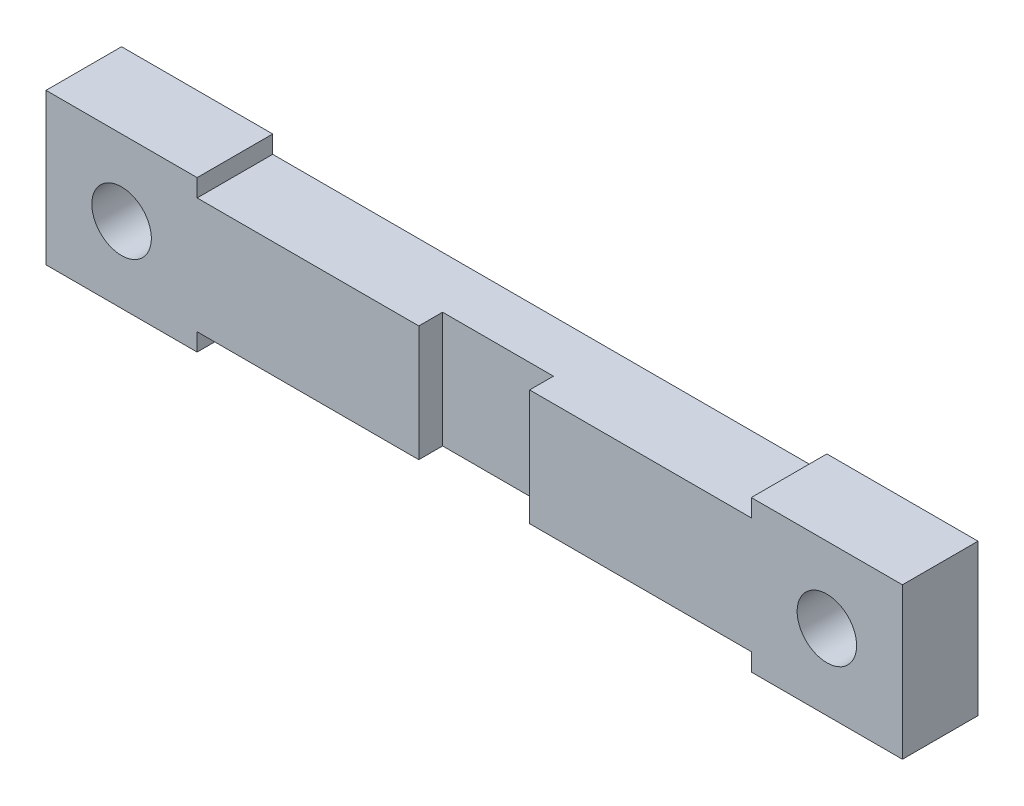
ISO-10303-21;
HEADER;
FILE_DESCRIPTION(('STEP AP214'),'2;1');
FILE_NAME('part.step','',(''),(''),'','','');
FILE_SCHEMA(('AUTOMOTIVE_DESIGN { 1 0 10303 214 1 1 1 1 }'));
ENDSEC;
DATA;
#1=APPLICATION_CONTEXT('core data for automotive mechanical design processes');
#2=APPLICATION_PROTOCOL_DEFINITION('international standard','automotive_design',2000,#1);
#3=PRODUCT_CONTEXT('',#1,'mechanical');
#4=PRODUCT('Part','Part','',(#3));
#5=PRODUCT_RELATED_PRODUCT_CATEGORY('part','',(#4));
#6=PRODUCT_DEFINITION_FORMATION('','',#4);
#7=PRODUCT_DEFINITION_CONTEXT('part definition',#1,'design');
#8=PRODUCT_DEFINITION('design','',#6,#7);
#9=PRODUCT_DEFINITION_SHAPE('','',#8);
#10=(LENGTH_UNIT() NAMED_UNIT(*) SI_UNIT(.MILLI.,.METRE.));
#11=(NAMED_UNIT(*) PLANE_ANGLE_UNIT() SI_UNIT($,.RADIAN.));
#12=(NAMED_UNIT(*) SI_UNIT($,.STERADIAN.) SOLID_ANGLE_UNIT());
#13=UNCERTAINTY_MEASURE_WITH_UNIT(LENGTH_MEASURE(1.E-05),#10,'distance_accuracy_value','');
#14=(GEOMETRIC_REPRESENTATION_CONTEXT(3) GLOBAL_UNCERTAINTY_ASSIGNED_CONTEXT((#13)) GLOBAL_UNIT_ASSIGNED_CONTEXT((#10,
#11,#12)) REPRESENTATION_CONTEXT('',''));
#15=CARTESIAN_POINT('',(0.,0.,0.));
#16=DIRECTION('',(0.,0.,1.));
#17=DIRECTION('',(1.,0.,0.));
#18=AXIS2_PLACEMENT_3D('',#15,#16,#17);
#19=CARTESIAN_POINT('',(0.,0.,3.81));
#20=DIRECTION('',(0.,0.,1.));
#21=DIRECTION('',(1.,0.,0.));
#22=AXIS2_PLACEMENT_3D('',#19,#20,#21);
#23=PLANE('',#22);
#24=DIRECTION('',(0.,1.,0.));
#25=VECTOR('',#24,1.);
#26=CARTESIAN_POINT('',(2.794,-2.921,3.81));
#27=LINE('',#26,#25);
#28=CARTESIAN_POINT('',(2.794,-2.921,3.81));
#29=VERTEX_POINT('',#28);
#30=CARTESIAN_POINT('',(2.794,2.921,3.81));
#31=VERTEX_POINT('',#30);
#32=EDGE_CURVE('E285',#29,#31,#27,.T.);
#33=ORIENTED_EDGE('',*,*,#32,.F.);
#34=DIRECTION('',(1.,0.,0.));
#35=VECTOR('',#34,1.);
#36=CARTESIAN_POINT('',(0.,-2.921,3.81));
#37=LINE('',#36,#35);
#38=CARTESIAN_POINT('',(13.97,-2.921,3.81));
#39=VERTEX_POINT('',#38);
#40=EDGE_CURVE('E260',#29,#39,#37,.T.);
#41=ORIENTED_EDGE('',*,*,#40,.T.);
#42=DIRECTION('',(0.,-1.,0.));
#43=VECTOR('',#42,1.);
#44=CARTESIAN_POINT('',(13.97,0.,3.81));
#45=LINE('',#44,#43);
#46=CARTESIAN_POINT('',(13.97,-3.81,3.81));
#47=VERTEX_POINT('',#46);
#48=EDGE_CURVE('E164',#39,#47,#45,.T.);
#49=ORIENTED_EDGE('',*,*,#48,.T.);
#50=DIRECTION('',(1.,0.,0.));
#51=VECTOR('',#50,1.);
#52=CARTESIAN_POINT('',(0.,-3.81,3.81));
#53=LINE('',#52,#51);
#54=CARTESIAN_POINT('',(21.59,-3.81,3.81));
#55=VERTEX_POINT('',#54);
#56=EDGE_CURVE('E171',#47,#55,#53,.T.);
#57=ORIENTED_EDGE('',*,*,#56,.T.);
#58=DIRECTION('',(0.,-1.,0.));
#59=VECTOR('',#58,1.);
#60=CARTESIAN_POINT('',(21.59,0.,3.81));
#61=LINE('',#60,#59);
#62=CARTESIAN_POINT('',(21.59,3.81,3.81));
#63=VERTEX_POINT('',#62);
#64=EDGE_CURVE('E169',#63,#55,#61,.T.);
#65=ORIENTED_EDGE('',*,*,#64,.F.);
#66=DIRECTION('',(1.,0.,0.));
#67=VECTOR('',#66,1.);
#68=CARTESIAN_POINT('',(0.,3.81,3.81));
#69=LINE('',#68,#67);
#70=CARTESIAN_POINT('',(13.97,3.81,3.81));
#71=VERTEX_POINT('',#70);
#72=EDGE_CURVE('E147',#71,#63,#69,.T.);
#73=ORIENTED_EDGE('',*,*,#72,.F.);
#74=CARTESIAN_POINT('',(13.97,2.921,3.81));
#75=VERTEX_POINT('',#74);
#76=EDGE_CURVE('E158',#71,#75,#45,.T.);
#77=ORIENTED_EDGE('',*,*,#76,.T.);
#78=DIRECTION('',(1.,0.,0.));
#79=VECTOR('',#78,1.);
#80=CARTESIAN_POINT('',(0.,2.921,3.81));
#81=LINE('',#80,#79);
#82=EDGE_CURVE('E162',#31,#75,#81,.T.);
#83=ORIENTED_EDGE('',*,*,#82,.F.);
#84=EDGE_LOOP('',(#33,#41,#49,#57,#65,#73,#77,#83));
#85=FACE_BOUND('',#84,.T.);
#86=CARTESIAN_POINT('',(17.78,0.,3.81));
#87=DIRECTION('',(0.,0.,1.));
#88=DIRECTION('',(1.,0.,0.));
#89=AXIS2_PLACEMENT_3D('',#86,#87,#88);
#90=CIRCLE('',#89,1.5);
#91=CARTESIAN_POINT('',(16.28,0.,3.81));
#92=VERTEX_POINT('',#91);
#93=EDGE_CURVE('E180',#92,#92,#90,.T.);
#94=ORIENTED_EDGE('',*,*,#93,.F.);
#95=EDGE_LOOP('',(#94));
#96=FACE_BOUND('',#95,.T.);
#97=ADVANCED_FACE('F41',(#85,#96),#23,.T.);
#98=CARTESIAN_POINT('',(-13.97,0.,3.81));
#99=DIRECTION('',(1.,0.,0.));
#100=DIRECTION('',(0.,0.,-1.));
#101=AXIS2_PLACEMENT_3D('',#98,#99,#100);
#102=PLANE('',#101);
#103=DIRECTION('',(0.,-1.,0.));
#104=VECTOR('',#103,1.);
#105=CARTESIAN_POINT('',(-13.97,0.,0.));
#106=LINE('',#105,#104);
#107=CARTESIAN_POINT('',(-13.97,3.81,0.));
#108=VERTEX_POINT('',#107);
#109=CARTESIAN_POINT('',(-13.97,2.921,0.));
#110=VERTEX_POINT('',#109);
#111=EDGE_CURVE('E183',#108,#110,#106,.T.);
#112=ORIENTED_EDGE('',*,*,#111,.F.);
#113=DIRECTION('',(0.,0.,-1.));
#114=VECTOR('',#113,1.);
#115=CARTESIAN_POINT('',(-13.97,3.81,3.81));
#116=LINE('',#115,#114);
#117=CARTESIAN_POINT('',(-13.97,3.81,3.81));
#118=VERTEX_POINT('',#117);
#119=EDGE_CURVE('E11',#118,#108,#116,.T.);
#120=ORIENTED_EDGE('',*,*,#119,.F.);
#121=DIRECTION('',(0.,-1.,0.));
#122=VECTOR('',#121,1.);
#123=CARTESIAN_POINT('',(-13.97,0.,3.81));
#124=LINE('',#123,#122);
#125=CARTESIAN_POINT('',(-13.97,2.921,3.81));
#126=VERTEX_POINT('',#125);
#127=EDGE_CURVE('E216',#118,#126,#124,.T.);
#128=ORIENTED_EDGE('',*,*,#127,.T.);
#129=DIRECTION('',(0.,0.,-1.));
#130=VECTOR('',#129,1.);
#131=CARTESIAN_POINT('',(-13.97,2.921,3.81));
#132=LINE('',#131,#130);
#133=EDGE_CURVE('E65',#126,#110,#132,.T.);
#134=ORIENTED_EDGE('',*,*,#133,.T.);
#135=EDGE_LOOP('',(#112,#120,#128,#134));
#136=FACE_BOUND('',#135,.T.);
#137=ADVANCED_FACE('F322',(#136),#102,.T.);
#138=CARTESIAN_POINT('',(0.,3.81,3.81));
#139=DIRECTION('',(0.,-1.,0.));
#140=DIRECTION('',(0.,0.,-1.));
#141=AXIS2_PLACEMENT_3D('',#138,#139,#140);
#142=PLANE('',#141);
#143=DIRECTION('',(-1.,0.,0.));
#144=VECTOR('',#143,1.);
#145=CARTESIAN_POINT('',(0.,3.81,0.));
#146=LINE('',#145,#144);
#147=CARTESIAN_POINT('',(-21.59,3.81,0.));
#148=VERTEX_POINT('',#147);
#149=EDGE_CURVE('E185',#108,#148,#146,.T.);
#150=ORIENTED_EDGE('',*,*,#149,.T.);
#151=DIRECTION('',(0.,0.,-1.));
#152=VECTOR('',#151,1.);
#153=CARTESIAN_POINT('',(-21.59,3.81,3.81));
#154=LINE('',#153,#152);
#155=CARTESIAN_POINT('',(-21.59,3.81,3.81));
#156=VERTEX_POINT('',#155);
#157=EDGE_CURVE('E49',#156,#148,#154,.T.);
#158=ORIENTED_EDGE('',*,*,#157,.F.);
#159=DIRECTION('',(-1.,0.,0.));
#160=VECTOR('',#159,1.);
#161=CARTESIAN_POINT('',(0.,3.81,3.81));
#162=LINE('',#161,#160);
#163=EDGE_CURVE('E262',#118,#156,#162,.T.);
#164=ORIENTED_EDGE('',*,*,#163,.F.);
#165=ORIENTED_EDGE('',*,*,#119,.T.);
#166=EDGE_LOOP('',(#150,#158,#164,#165));
#167=FACE_BOUND('',#166,.T.);
#168=ADVANCED_FACE('F43',(#167),#142,.F.);
#169=CARTESIAN_POINT('',(-21.59,0.,3.81));
#170=DIRECTION('',(1.,0.,0.));
#171=DIRECTION('',(0.,0.,-1.));
#172=AXIS2_PLACEMENT_3D('',#169,#170,#171);
#173=PLANE('',#172);
#174=DIRECTION('',(0.,-1.,0.));
#175=VECTOR('',#174,1.);
#176=CARTESIAN_POINT('',(-21.59,0.,0.));
#177=LINE('',#176,#175);
#178=CARTESIAN_POINT('',(-21.59,-3.81,0.));
#179=VERTEX_POINT('',#178);
#180=EDGE_CURVE('E189',#148,#179,#177,.T.);
#181=ORIENTED_EDGE('',*,*,#180,.T.);
#182=DIRECTION('',(0.,0.,-1.));
#183=VECTOR('',#182,1.);
#184=CARTESIAN_POINT('',(-21.59,-3.81,3.81));
#185=LINE('',#184,#183);
#186=CARTESIAN_POINT('',(-21.59,-3.81,3.81));
#187=VERTEX_POINT('',#186);
#188=EDGE_CURVE('E232',#187,#179,#185,.T.);
#189=ORIENTED_EDGE('',*,*,#188,.F.);
#190=DIRECTION('',(0.,-1.,0.));
#191=VECTOR('',#190,1.);
#192=CARTESIAN_POINT('',(-21.59,0.,3.81));
#193=LINE('',#192,#191);
#194=EDGE_CURVE('E240',#156,#187,#193,.T.);
#195=ORIENTED_EDGE('',*,*,#194,.F.);
#196=ORIENTED_EDGE('',*,*,#157,.T.);
#197=EDGE_LOOP('',(#181,#189,#195,#196));
#198=FACE_BOUND('',#197,.T.);
#199=ADVANCED_FACE('F238',(#198),#173,.F.);
#200=CARTESIAN_POINT('',(0.,-3.81,3.81));
#201=DIRECTION('',(0.,-1.,0.));
#202=DIRECTION('',(0.,0.,-1.));
#203=AXIS2_PLACEMENT_3D('',#200,#201,#202);
#204=PLANE('',#203);
#205=DIRECTION('',(-1.,0.,0.));
#206=VECTOR('',#205,1.);
#207=CARTESIAN_POINT('',(0.,-3.81,0.));
#208=LINE('',#207,#206);
#209=CARTESIAN_POINT('',(-13.97,-3.81,0.));
#210=VERTEX_POINT('',#209);
#211=EDGE_CURVE('E192',#210,#179,#208,.T.);
#212=ORIENTED_EDGE('',*,*,#211,.F.);
#213=DIRECTION('',(0.,0.,-1.));
#214=VECTOR('',#213,1.);
#215=CARTESIAN_POINT('',(-13.97,-3.81,3.81));
#216=LINE('',#215,#214);
#217=CARTESIAN_POINT('',(-13.97,-3.81,3.81));
#218=VERTEX_POINT('',#217);
#219=EDGE_CURVE('E230',#218,#210,#216,.T.);
#220=ORIENTED_EDGE('',*,*,#219,.F.);
#221=DIRECTION('',(-1.,0.,0.));
#222=VECTOR('',#221,1.);
#223=CARTESIAN_POINT('',(0.,-3.81,3.81));
#224=LINE('',#223,#222);
#225=EDGE_CURVE('E254',#218,#187,#224,.T.);
#226=ORIENTED_EDGE('',*,*,#225,.T.);
#227=ORIENTED_EDGE('',*,*,#188,.T.);
#228=EDGE_LOOP('',(#212,#220,#226,#227));
#229=FACE_BOUND('',#228,.T.);
#230=ADVANCED_FACE('F251',(#229),#204,.T.);
#231=CARTESIAN_POINT('',(-13.97,-2.921,0.));
#232=VERTEX_POINT('',#231);
#233=EDGE_CURVE('E187',#232,#210,#106,.T.);
#234=ORIENTED_EDGE('',*,*,#233,.F.);
#235=DIRECTION('',(0.,0.,-1.));
#236=VECTOR('',#235,1.);
#237=CARTESIAN_POINT('',(-13.97,-2.921,3.81));
#238=LINE('',#237,#236);
#239=CARTESIAN_POINT('',(-13.97,-2.921,3.81));
#240=VERTEX_POINT('',#239);
#241=EDGE_CURVE('E228',#240,#232,#238,.T.);
#242=ORIENTED_EDGE('',*,*,#241,.F.);
#243=EDGE_CURVE('E258',#240,#218,#124,.T.);
#244=ORIENTED_EDGE('',*,*,#243,.T.);
#245=ORIENTED_EDGE('',*,*,#219,.T.);
#246=EDGE_LOOP('',(#234,#242,#244,#245));
#247=FACE_BOUND('',#246,.T.);
#248=ADVANCED_FACE('F328',(#247),#102,.T.);
#249=CARTESIAN_POINT('',(0.,-2.921,3.81));
#250=DIRECTION('',(0.,1.,0.));
#251=DIRECTION('',(0.,0.,1.));
#252=AXIS2_PLACEMENT_3D('',#249,#250,#251);
#253=PLANE('',#252);
#254=ORIENTED_EDGE('',*,*,#40,.F.);
#255=DIRECTION('',(0.,0.,1.));
#256=VECTOR('',#255,1.);
#257=CARTESIAN_POINT('',(2.794,-2.921,2.61));
#258=LINE('',#257,#256);
#259=CARTESIAN_POINT('',(2.794,-2.921,2.61));
#260=VERTEX_POINT('',#259);
#261=EDGE_CURVE('E186',#260,#29,#258,.T.);
#262=ORIENTED_EDGE('',*,*,#261,.F.);
#263=DIRECTION('',(1.,0.,0.));
#264=VECTOR('',#263,1.);
#265=CARTESIAN_POINT('',(-2.794,-2.921,2.61));
#266=LINE('',#265,#264);
#267=CARTESIAN_POINT('',(-2.794,-2.921,2.61));
#268=VERTEX_POINT('',#267);
#269=EDGE_CURVE('E316',#268,#260,#266,.T.);
#270=ORIENTED_EDGE('',*,*,#269,.F.);
#271=DIRECTION('',(0.,0.,1.));
#272=VECTOR('',#271,1.);
#273=CARTESIAN_POINT('',(-2.794,-2.921,2.61));
#274=LINE('',#273,#272);
#275=CARTESIAN_POINT('',(-2.794,-2.921,3.81));
#276=VERTEX_POINT('',#275);
#277=EDGE_CURVE('E307',#268,#276,#274,.T.);
#278=ORIENTED_EDGE('',*,*,#277,.T.);
#279=EDGE_CURVE('E266',#240,#276,#37,.T.);
#280=ORIENTED_EDGE('',*,*,#279,.F.);
#281=ORIENTED_EDGE('',*,*,#241,.T.);
#282=DIRECTION('',(1.,0.,0.));
#283=VECTOR('',#282,1.);
#284=CARTESIAN_POINT('',(0.,-2.921,0.));
#285=LINE('',#284,#283);
#286=CARTESIAN_POINT('',(13.97,-2.921,0.));
#287=VERTEX_POINT('',#286);
#288=EDGE_CURVE('E195',#232,#287,#285,.T.);
#289=ORIENTED_EDGE('',*,*,#288,.T.);
#290=DIRECTION('',(0.,0.,-1.));
#291=VECTOR('',#290,1.);
#292=CARTESIAN_POINT('',(13.97,-2.921,3.81));
#293=LINE('',#292,#291);
#294=EDGE_CURVE('E225',#39,#287,#293,.T.);
#295=ORIENTED_EDGE('',*,*,#294,.F.);
#296=EDGE_LOOP('',(#254,#262,#270,#278,#280,#281,#289,#295));
#297=FACE_BOUND('',#296,.T.);
#298=ADVANCED_FACE('F364',(#297),#253,.F.);
#299=CARTESIAN_POINT('',(13.97,0.,3.81));
#300=DIRECTION('',(1.,0.,0.));
#301=DIRECTION('',(0.,0.,-1.));
#302=AXIS2_PLACEMENT_3D('',#299,#300,#301);
#303=PLANE('',#302);
#304=DIRECTION('',(0.,-1.,0.));
#305=VECTOR('',#304,1.);
#306=CARTESIAN_POINT('',(13.97,0.,0.));
#307=LINE('',#306,#305);
#308=CARTESIAN_POINT('',(13.97,-3.81,0.));
#309=VERTEX_POINT('',#308);
#310=EDGE_CURVE('E197',#287,#309,#307,.T.);
#311=ORIENTED_EDGE('',*,*,#310,.T.);
#312=DIRECTION('',(0.,0.,-1.));
#313=VECTOR('',#312,1.);
#314=CARTESIAN_POINT('',(13.97,-3.81,3.81));
#315=LINE('',#314,#313);
#316=EDGE_CURVE('E222',#47,#309,#315,.T.);
#317=ORIENTED_EDGE('',*,*,#316,.F.);
#318=ORIENTED_EDGE('',*,*,#48,.F.);
#319=ORIENTED_EDGE('',*,*,#294,.T.);
#320=EDGE_LOOP('',(#311,#317,#318,#319));
#321=FACE_BOUND('',#320,.T.);
#322=ADVANCED_FACE('F357',(#321),#303,.F.);
#323=CARTESIAN_POINT('',(0.,-3.81,3.81));
#324=DIRECTION('',(0.,1.,0.));
#325=DIRECTION('',(0.,0.,1.));
#326=AXIS2_PLACEMENT_3D('',#323,#324,#325);
#327=PLANE('',#326);
#328=DIRECTION('',(1.,0.,0.));
#329=VECTOR('',#328,1.);
#330=CARTESIAN_POINT('',(0.,-3.81,0.));
#331=LINE('',#330,#329);
#332=CARTESIAN_POINT('',(21.59,-3.81,0.));
#333=VERTEX_POINT('',#332);
#334=EDGE_CURVE('E199',#309,#333,#331,.T.);
#335=ORIENTED_EDGE('',*,*,#334,.T.);
#336=DIRECTION('',(0.,0.,-1.));
#337=VECTOR('',#336,1.);
#338=CARTESIAN_POINT('',(21.59,-3.81,3.81));
#339=LINE('',#338,#337);
#340=EDGE_CURVE('E220',#55,#333,#339,.T.);
#341=ORIENTED_EDGE('',*,*,#340,.F.);
#342=ORIENTED_EDGE('',*,*,#56,.F.);
#343=ORIENTED_EDGE('',*,*,#316,.T.);
#344=EDGE_LOOP('',(#335,#341,#342,#343));
#345=FACE_BOUND('',#344,.T.);
#346=ADVANCED_FACE('F273',(#345),#327,.F.);
#347=CARTESIAN_POINT('',(21.59,0.,3.81));
#348=DIRECTION('',(1.,0.,0.));
#349=DIRECTION('',(0.,0.,-1.));
#350=AXIS2_PLACEMENT_3D('',#347,#348,#349);
#351=PLANE('',#350);
#352=DIRECTION('',(0.,-1.,0.));
#353=VECTOR('',#352,1.);
#354=CARTESIAN_POINT('',(21.59,0.,0.));
#355=LINE('',#354,#353);
#356=CARTESIAN_POINT('',(21.59,3.81,0.));
#357=VERTEX_POINT('',#356);
#358=EDGE_CURVE('E203',#357,#333,#355,.T.);
#359=ORIENTED_EDGE('',*,*,#358,.F.);
#360=DIRECTION('',(0.,0.,-1.));
#361=VECTOR('',#360,1.);
#362=CARTESIAN_POINT('',(21.59,3.81,3.81));
#363=LINE('',#362,#361);
#364=EDGE_CURVE('E153',#63,#357,#363,.T.);
#365=ORIENTED_EDGE('',*,*,#364,.F.);
#366=ORIENTED_EDGE('',*,*,#64,.T.);
#367=ORIENTED_EDGE('',*,*,#340,.T.);
#368=EDGE_LOOP('',(#359,#365,#366,#367));
#369=FACE_BOUND('',#368,.T.);
#370=ADVANCED_FACE('F277',(#369),#351,.T.);
#371=CARTESIAN_POINT('',(0.,3.81,3.81));
#372=DIRECTION('',(0.,1.,0.));
#373=DIRECTION('',(0.,0.,1.));
#374=AXIS2_PLACEMENT_3D('',#371,#372,#373);
#375=PLANE('',#374);
#376=DIRECTION('',(1.,0.,0.));
#377=VECTOR('',#376,1.);
#378=CARTESIAN_POINT('',(0.,3.81,0.));
#379=LINE('',#378,#377);
#380=CARTESIAN_POINT('',(13.97,3.81,0.));
#381=VERTEX_POINT('',#380);
#382=EDGE_CURVE('E149',#381,#357,#379,.T.);
#383=ORIENTED_EDGE('',*,*,#382,.F.);
#384=DIRECTION('',(0.,0.,-1.));
#385=VECTOR('',#384,1.);
#386=CARTESIAN_POINT('',(13.97,3.81,3.81));
#387=LINE('',#386,#385);
#388=EDGE_CURVE('E143',#71,#381,#387,.T.);
#389=ORIENTED_EDGE('',*,*,#388,.F.);
#390=ORIENTED_EDGE('',*,*,#72,.T.);
#391=ORIENTED_EDGE('',*,*,#364,.T.);
#392=EDGE_LOOP('',(#383,#389,#390,#391));
#393=FACE_BOUND('',#392,.T.);
#394=ADVANCED_FACE('F145',(#393),#375,.T.);
#395=CARTESIAN_POINT('',(13.97,2.921,0.));
#396=VERTEX_POINT('',#395);
#397=EDGE_CURVE('E200',#381,#396,#307,.T.);
#398=ORIENTED_EDGE('',*,*,#397,.T.);
#399=DIRECTION('',(0.,0.,-1.));
#400=VECTOR('',#399,1.);
#401=CARTESIAN_POINT('',(13.97,2.921,3.81));
#402=LINE('',#401,#400);
#403=EDGE_CURVE('E154',#75,#396,#402,.T.);
#404=ORIENTED_EDGE('',*,*,#403,.F.);
#405=ORIENTED_EDGE('',*,*,#76,.F.);
#406=ORIENTED_EDGE('',*,*,#388,.T.);
#407=EDGE_LOOP('',(#398,#404,#405,#406));
#408=FACE_BOUND('',#407,.T.);
#409=ADVANCED_FACE('F159',(#408),#303,.F.);
#410=CARTESIAN_POINT('',(-17.78,0.,3.81));
#411=DIRECTION('',(0.,0.,-1.));
#412=DIRECTION('',(-1.,0.,0.));
#413=AXIS2_PLACEMENT_3D('',#410,#411,#412);
#414=CYLINDRICAL_SURFACE('',#413,1.5);
#415=CARTESIAN_POINT('',(-17.78,0.,3.81));
#416=DIRECTION('',(0.,0.,1.));
#417=DIRECTION('',(1.,0.,0.));
#418=AXIS2_PLACEMENT_3D('',#415,#416,#417);
#419=CIRCLE('',#418,1.5);
#420=CARTESIAN_POINT('',(-19.28,0.,3.81));
#421=VERTEX_POINT('',#420);
#422=EDGE_CURVE('E177',#421,#421,#419,.F.);
#423=CARTESIAN_POINT('',(-17.78,0.,0.));
#424=DIRECTION('',(0.,0.,1.));
#425=DIRECTION('',(1.,0.,0.));
#426=AXIS2_PLACEMENT_3D('',#423,#424,#425);
#427=CIRCLE('',#426,1.5);
#428=CARTESIAN_POINT('',(-19.28,0.,0.));
#429=VERTEX_POINT('',#428);
#430=EDGE_CURVE('E210',#429,#429,#427,.F.);
#431=CARTESIAN_POINT('',(-19.28,0.,3.81));
#432=CARTESIAN_POINT('',(-19.28,0.,3.7703125));
#433=CARTESIAN_POINT('',(-19.28,0.,3.730625));
#434=CARTESIAN_POINT('',(-19.28,0.,3.65125));
#435=CARTESIAN_POINT('',(-19.28,0.,3.6115625));
#436=CARTESIAN_POINT('',(-19.28,0.,3.5321875));
#437=CARTESIAN_POINT('',(-19.28,0.,3.4925));
#438=CARTESIAN_POINT('',(-19.28,0.,3.413125));
#439=CARTESIAN_POINT('',(-19.28,0.,3.3734375));
#440=CARTESIAN_POINT('',(-19.28,0.,3.2940625));
#441=CARTESIAN_POINT('',(-19.28,0.,3.254375));
#442=CARTESIAN_POINT('',(-19.28,0.,3.175));
#443=CARTESIAN_POINT('',(-19.28,0.,3.1353125));
#444=CARTESIAN_POINT('',(-19.28,0.,3.0559375));
#445=CARTESIAN_POINT('',(-19.28,0.,3.01625));
#446=CARTESIAN_POINT('',(-19.28,0.,2.936875));
#447=CARTESIAN_POINT('',(-19.28,0.,2.8971875));
#448=CARTESIAN_POINT('',(-19.28,0.,2.8178125));
#449=CARTESIAN_POINT('',(-19.28,0.,2.778125));
#450=CARTESIAN_POINT('',(-19.28,0.,2.69875));
#451=CARTESIAN_POINT('',(-19.28,0.,2.6590625));
#452=CARTESIAN_POINT('',(-19.28,0.,2.5796875));
#453=CARTESIAN_POINT('',(-19.28,0.,2.54));
#454=CARTESIAN_POINT('',(-19.28,0.,2.460625));
#455=CARTESIAN_POINT('',(-19.28,0.,2.4209375));
#456=CARTESIAN_POINT('',(-19.28,0.,2.3415625));
#457=CARTESIAN_POINT('',(-19.28,0.,2.301875));
#458=CARTESIAN_POINT('',(-19.28,0.,2.2225));
#459=CARTESIAN_POINT('',(-19.28,0.,2.1828125));
#460=CARTESIAN_POINT('',(-19.28,0.,2.1034375));
#461=CARTESIAN_POINT('',(-19.28,0.,2.06375));
#462=CARTESIAN_POINT('',(-19.28,0.,1.984375));
#463=CARTESIAN_POINT('',(-19.28,0.,1.9446875));
#464=CARTESIAN_POINT('',(-19.28,0.,1.8653125));
#465=CARTESIAN_POINT('',(-19.28,0.,1.825625));
#466=CARTESIAN_POINT('',(-19.28,0.,1.74625));
#467=CARTESIAN_POINT('',(-19.28,0.,1.7065625));
#468=CARTESIAN_POINT('',(-19.28,0.,1.6271875));
#469=CARTESIAN_POINT('',(-19.28,0.,1.5875));
#470=CARTESIAN_POINT('',(-19.28,0.,1.508125));
#471=CARTESIAN_POINT('',(-19.28,0.,1.4684375));
#472=CARTESIAN_POINT('',(-19.28,0.,1.3890625));
#473=CARTESIAN_POINT('',(-19.28,0.,1.349375));
#474=CARTESIAN_POINT('',(-19.28,0.,1.27));
#475=CARTESIAN_POINT('',(-19.28,0.,1.2303125));
#476=CARTESIAN_POINT('',(-19.28,0.,1.1509375));
#477=CARTESIAN_POINT('',(-19.28,0.,1.11125));
#478=CARTESIAN_POINT('',(-19.28,0.,1.031875));
#479=CARTESIAN_POINT('',(-19.28,0.,0.9921875));
#480=CARTESIAN_POINT('',(-19.28,0.,0.9128125));
#481=CARTESIAN_POINT('',(-19.28,0.,0.873125));
#482=CARTESIAN_POINT('',(-19.28,0.,0.79375));
#483=CARTESIAN_POINT('',(-19.28,0.,0.7540625));
#484=CARTESIAN_POINT('',(-19.28,0.,0.6746875));
#485=CARTESIAN_POINT('',(-19.28,0.,0.635));
#486=CARTESIAN_POINT('',(-19.28,0.,0.555625));
#487=CARTESIAN_POINT('',(-19.28,0.,0.5159375));
#488=CARTESIAN_POINT('',(-19.28,0.,0.4365625));
#489=CARTESIAN_POINT('',(-19.28,0.,0.396875));
#490=CARTESIAN_POINT('',(-19.28,0.,0.3175));
#491=CARTESIAN_POINT('',(-19.28,0.,0.2778125));
#492=CARTESIAN_POINT('',(-19.28,0.,0.1984375));
#493=CARTESIAN_POINT('',(-19.28,0.,0.15875));
#494=CARTESIAN_POINT('',(-19.28,0.,0.0793749999999999));
#495=CARTESIAN_POINT('',(-19.28,0.,0.0396874999999999));
#496=CARTESIAN_POINT('',(-19.28,0.,0.));
#497=B_SPLINE_CURVE_WITH_KNOTS('',3,(#431,#432,#433,#434,#435,#436,#437,#438,#439,#440,#441,
#442,#443,#444,#445,#446,#447,#448,#449,#450,#451,#452,#453,#454,#455,#456,#457,#458,#459,#460,
#461,#462,#463,#464,#465,#466,#467,#468,#469,#470,#471,#472,#473,#474,#475,#476,#477,#478,#479,
#480,#481,#482,#483,#484,#485,#486,#487,#488,#489,#490,#491,#492,#493,#494,#495,#496),
.UNSPECIFIED.,.F.,.F.,(4,2,2,2,2,2,2,2,2,2,2,2,2,2,2,2,2,2,2,2,2,2,2,2,2,2,2,2,2,2,2,2,4),(0.,
0.1190625,0.238125,0.3571875,0.47625,0.595312499999999,0.714375,0.833437499999999,
0.952499999999999,1.0715625,1.190625,1.3096875,1.42875,1.5478125,1.666875,1.7859375,1.905,
2.0240625,2.143125,2.2621875,2.38125,2.5003125,2.619375,2.7384375,2.8575,2.9765625,3.095625,
3.2146875,3.33375,3.4528125,3.571875,3.6909375,3.81),.UNSPECIFIED.);
#498=EDGE_CURVE('BSEAM349',#421,#429,#497,.T.);
#499=ORIENTED_EDGE('',*,*,#422,.F.);
#500=ORIENTED_EDGE('',*,*,#430,.T.);
#501=ORIENTED_EDGE('',*,*,#498,.T.);
#502=ORIENTED_EDGE('',*,*,#498,.F.);
#503=EDGE_LOOP('',(#499,#501,#500,#502));
#504=FACE_BOUND('',#503,.T.);
#505=ADVANCED_FACE('F349',(#504),#414,.F.);
#506=CARTESIAN_POINT('',(0.,2.921,3.81));
#507=DIRECTION('',(0.,1.,0.));
#508=DIRECTION('',(0.,0.,1.));
#509=AXIS2_PLACEMENT_3D('',#506,#507,#508);
#510=PLANE('',#509);
#511=DIRECTION('',(0.,0.,1.));
#512=VECTOR('',#511,1.);
#513=CARTESIAN_POINT('',(2.794,2.921,2.61));
#514=LINE('',#513,#512);
#515=CARTESIAN_POINT('',(2.794,2.921,2.61));
#516=VERTEX_POINT('',#515);
#517=EDGE_CURVE('E283',#516,#31,#514,.T.);
#518=ORIENTED_EDGE('',*,*,#517,.T.);
#519=ORIENTED_EDGE('',*,*,#82,.T.);
#520=ORIENTED_EDGE('',*,*,#403,.T.);
#521=DIRECTION('',(1.,0.,0.));
#522=VECTOR('',#521,1.);
#523=CARTESIAN_POINT('',(0.,2.921,0.));
#524=LINE('',#523,#522);
#525=EDGE_CURVE('E207',#110,#396,#524,.T.);
#526=ORIENTED_EDGE('',*,*,#525,.F.);
#527=ORIENTED_EDGE('',*,*,#133,.F.);
#528=CARTESIAN_POINT('',(-2.794,2.921,3.81));
#529=VERTEX_POINT('',#528);
#530=EDGE_CURVE('E175',#126,#529,#81,.T.);
#531=ORIENTED_EDGE('',*,*,#530,.T.);
#532=DIRECTION('',(0.,0.,1.));
#533=VECTOR('',#532,1.);
#534=CARTESIAN_POINT('',(-2.794,2.921,2.61));
#535=LINE('',#534,#533);
#536=CARTESIAN_POINT('',(-2.794,2.921,2.61));
#537=VERTEX_POINT('',#536);
#538=EDGE_CURVE('E56',#537,#529,#535,.T.);
#539=ORIENTED_EDGE('',*,*,#538,.F.);
#540=DIRECTION('',(-1.,0.,0.));
#541=VECTOR('',#540,1.);
#542=CARTESIAN_POINT('',(-2.794,2.921,2.61));
#543=LINE('',#542,#541);
#544=EDGE_CURVE('E485',#516,#537,#543,.T.);
#545=ORIENTED_EDGE('',*,*,#544,.F.);
#546=EDGE_LOOP('',(#518,#519,#520,#526,#527,#531,#539,#545));
#547=FACE_BOUND('',#546,.T.);
#548=ADVANCED_FACE('F279',(#547),#510,.T.);
#549=CARTESIAN_POINT('',(17.78,0.,3.81));
#550=DIRECTION('',(0.,0.,-1.));
#551=DIRECTION('',(-1.,0.,0.));
#552=AXIS2_PLACEMENT_3D('',#549,#550,#551);
#553=CYLINDRICAL_SURFACE('',#552,1.5);
#554=CARTESIAN_POINT('',(17.78,0.,0.));
#555=DIRECTION('',(0.,0.,1.));
#556=DIRECTION('',(1.,0.,0.));
#557=AXIS2_PLACEMENT_3D('',#554,#555,#556);
#558=CIRCLE('',#557,1.5);
#559=CARTESIAN_POINT('',(16.28,0.,0.));
#560=VERTEX_POINT('',#559);
#561=EDGE_CURVE('E213',#560,#560,#558,.T.);
#562=CARTESIAN_POINT('',(16.28,0.,3.81));
#563=CARTESIAN_POINT('',(16.28,0.,3.7703125));
#564=CARTESIAN_POINT('',(16.28,0.,3.730625));
#565=CARTESIAN_POINT('',(16.28,0.,3.65125));
#566=CARTESIAN_POINT('',(16.28,0.,3.6115625));
#567=CARTESIAN_POINT('',(16.28,0.,3.5321875));
#568=CARTESIAN_POINT('',(16.28,0.,3.4925));
#569=CARTESIAN_POINT('',(16.28,0.,3.413125));
#570=CARTESIAN_POINT('',(16.28,0.,3.3734375));
#571=CARTESIAN_POINT('',(16.28,0.,3.2940625));
#572=CARTESIAN_POINT('',(16.28,0.,3.254375));
#573=CARTESIAN_POINT('',(16.28,0.,3.175));
#574=CARTESIAN_POINT('',(16.28,0.,3.1353125));
#575=CARTESIAN_POINT('',(16.28,0.,3.0559375));
#576=CARTESIAN_POINT('',(16.28,0.,3.01625));
#577=CARTESIAN_POINT('',(16.28,0.,2.936875));
#578=CARTESIAN_POINT('',(16.28,0.,2.8971875));
#579=CARTESIAN_POINT('',(16.28,0.,2.8178125));
#580=CARTESIAN_POINT('',(16.28,0.,2.778125));
#581=CARTESIAN_POINT('',(16.28,0.,2.69875));
#582=CARTESIAN_POINT('',(16.28,0.,2.6590625));
#583=CARTESIAN_POINT('',(16.28,0.,2.5796875));
#584=CARTESIAN_POINT('',(16.28,0.,2.54));
#585=CARTESIAN_POINT('',(16.28,0.,2.460625));
#586=CARTESIAN_POINT('',(16.28,0.,2.4209375));
#587=CARTESIAN_POINT('',(16.28,0.,2.3415625));
#588=CARTESIAN_POINT('',(16.28,0.,2.301875));
#589=CARTESIAN_POINT('',(16.28,0.,2.2225));
#590=CARTESIAN_POINT('',(16.28,0.,2.1828125));
#591=CARTESIAN_POINT('',(16.28,0.,2.1034375));
#592=CARTESIAN_POINT('',(16.28,0.,2.06375));
#593=CARTESIAN_POINT('',(16.28,0.,1.984375));
#594=CARTESIAN_POINT('',(16.28,0.,1.9446875));
#595=CARTESIAN_POINT('',(16.28,0.,1.8653125));
#596=CARTESIAN_POINT('',(16.28,0.,1.825625));
#597=CARTESIAN_POINT('',(16.28,0.,1.74625));
#598=CARTESIAN_POINT('',(16.28,0.,1.7065625));
#599=CARTESIAN_POINT('',(16.28,0.,1.6271875));
#600=CARTESIAN_POINT('',(16.28,0.,1.5875));
#601=CARTESIAN_POINT('',(16.28,0.,1.508125));
#602=CARTESIAN_POINT('',(16.28,0.,1.4684375));
#603=CARTESIAN_POINT('',(16.28,0.,1.3890625));
#604=CARTESIAN_POINT('',(16.28,0.,1.349375));
#605=CARTESIAN_POINT('',(16.28,0.,1.27));
#606=CARTESIAN_POINT('',(16.28,0.,1.2303125));
#607=CARTESIAN_POINT('',(16.28,0.,1.1509375));
#608=CARTESIAN_POINT('',(16.28,0.,1.11125));
#609=CARTESIAN_POINT('',(16.28,0.,1.031875));
#610=CARTESIAN_POINT('',(16.28,0.,0.9921875));
#611=CARTESIAN_POINT('',(16.28,0.,0.9128125));
#612=CARTESIAN_POINT('',(16.28,0.,0.873125));
#613=CARTESIAN_POINT('',(16.28,0.,0.79375));
#614=CARTESIAN_POINT('',(16.28,0.,0.7540625));
#615=CARTESIAN_POINT('',(16.28,0.,0.6746875));
#616=CARTESIAN_POINT('',(16.28,0.,0.635));
#617=CARTESIAN_POINT('',(16.28,0.,0.555625));
#618=CARTESIAN_POINT('',(16.28,0.,0.5159375));
#619=CARTESIAN_POINT('',(16.28,0.,0.4365625));
#620=CARTESIAN_POINT('',(16.28,0.,0.396875));
#621=CARTESIAN_POINT('',(16.28,0.,0.3175));
#622=CARTESIAN_POINT('',(16.28,0.,0.2778125));
#623=CARTESIAN_POINT('',(16.28,0.,0.1984375));
#624=CARTESIAN_POINT('',(16.28,0.,0.15875));
#625=CARTESIAN_POINT('',(16.28,0.,0.0793749999999999));
#626=CARTESIAN_POINT('',(16.28,0.,0.0396874999999999));
#627=CARTESIAN_POINT('',(16.28,0.,0.));
#628=B_SPLINE_CURVE_WITH_KNOTS('',3,(#562,#563,#564,#565,#566,#567,#568,#569,#570,#571,#572,
#573,#574,#575,#576,#577,#578,#579,#580,#581,#582,#583,#584,#585,#586,#587,#588,#589,#590,#591,
#592,#593,#594,#595,#596,#597,#598,#599,#600,#601,#602,#603,#604,#605,#606,#607,#608,#609,#610,
#611,#612,#613,#614,#615,#616,#617,#618,#619,#620,#621,#622,#623,#624,#625,#626,#627),
.UNSPECIFIED.,.F.,.F.,(4,2,2,2,2,2,2,2,2,2,2,2,2,2,2,2,2,2,2,2,2,2,2,2,2,2,2,2,2,2,2,2,4),(0.,
0.1190625,0.238125,0.3571875,0.47625,0.595312499999999,0.714375,0.833437499999999,
0.952499999999999,1.0715625,1.190625,1.3096875,1.42875,1.5478125,1.666875,1.7859375,1.905,
2.0240625,2.143125,2.2621875,2.38125,2.5003125,2.619375,2.7384375,2.8575,2.9765625,3.095625,
3.2146875,3.33375,3.4528125,3.571875,3.6909375,3.81),.UNSPECIFIED.);
#629=EDGE_CURVE('BSEAM338',#92,#560,#628,.T.);
#630=ORIENTED_EDGE('',*,*,#93,.T.);
#631=ORIENTED_EDGE('',*,*,#561,.F.);
#632=ORIENTED_EDGE('',*,*,#629,.T.);
#633=ORIENTED_EDGE('',*,*,#629,.F.);
#634=EDGE_LOOP('',(#630,#632,#631,#633));
#635=FACE_BOUND('',#634,.T.);
#636=ADVANCED_FACE('F338',(#635),#553,.F.);
#637=DIRECTION('',(0.,-1.,0.));
#638=VECTOR('',#637,1.);
#639=CARTESIAN_POINT('',(-2.794,-2.921,3.81));
#640=LINE('',#639,#638);
#641=EDGE_CURVE('E312',#529,#276,#640,.T.);
#642=ORIENTED_EDGE('',*,*,#641,.F.);
#643=ORIENTED_EDGE('',*,*,#530,.F.);
#644=ORIENTED_EDGE('',*,*,#127,.F.);
#645=ORIENTED_EDGE('',*,*,#163,.T.);
#646=ORIENTED_EDGE('',*,*,#194,.T.);
#647=ORIENTED_EDGE('',*,*,#225,.F.);
#648=ORIENTED_EDGE('',*,*,#243,.F.);
#649=ORIENTED_EDGE('',*,*,#279,.T.);
#650=EDGE_LOOP('',(#642,#643,#644,#645,#646,#647,#648,#649));
#651=FACE_BOUND('',#650,.T.);
#652=ORIENTED_EDGE('',*,*,#422,.T.);
#653=EDGE_LOOP('',(#652));
#654=FACE_BOUND('',#653,.T.);
#655=ADVANCED_FACE('F318',(#651,#654),#23,.T.);
#656=CARTESIAN_POINT('',(0.,0.,0.));
#657=DIRECTION('',(0.,0.,1.));
#658=DIRECTION('',(1.,0.,0.));
#659=AXIS2_PLACEMENT_3D('',#656,#657,#658);
#660=PLANE('',#659);
#661=ORIENTED_EDGE('',*,*,#111,.T.);
#662=ORIENTED_EDGE('',*,*,#525,.T.);
#663=ORIENTED_EDGE('',*,*,#397,.F.);
#664=ORIENTED_EDGE('',*,*,#382,.T.);
#665=ORIENTED_EDGE('',*,*,#358,.T.);
#666=ORIENTED_EDGE('',*,*,#334,.F.);
#667=ORIENTED_EDGE('',*,*,#310,.F.);
#668=ORIENTED_EDGE('',*,*,#288,.F.);
#669=ORIENTED_EDGE('',*,*,#233,.T.);
#670=ORIENTED_EDGE('',*,*,#211,.T.);
#671=ORIENTED_EDGE('',*,*,#180,.F.);
#672=ORIENTED_EDGE('',*,*,#149,.F.);
#673=EDGE_LOOP('',(#661,#662,#663,#664,#665,#666,#667,#668,#669,#670,#671,#672));
#674=FACE_BOUND('',#673,.T.);
#675=ORIENTED_EDGE('',*,*,#430,.F.);
#676=EDGE_LOOP('',(#675));
#677=FACE_BOUND('',#676,.T.);
#678=ORIENTED_EDGE('',*,*,#561,.T.);
#679=EDGE_LOOP('',(#678));
#680=FACE_BOUND('',#679,.T.);
#681=ADVANCED_FACE('F244',(#674,#677,#680),#660,.F.);
#682=CARTESIAN_POINT('',(2.794,-2.921,2.61));
#683=DIRECTION('',(1.,0.,0.));
#684=DIRECTION('',(0.,0.,-1.));
#685=AXIS2_PLACEMENT_3D('',#682,#683,#684);
#686=PLANE('',#685);
#687=ORIENTED_EDGE('',*,*,#32,.T.);
#688=ORIENTED_EDGE('',*,*,#517,.F.);
#689=DIRECTION('',(0.,1.,0.));
#690=VECTOR('',#689,1.);
#691=CARTESIAN_POINT('',(2.794,-2.921,2.61));
#692=LINE('',#691,#690);
#693=EDGE_CURVE('E303',#260,#516,#692,.T.);
#694=ORIENTED_EDGE('',*,*,#693,.F.);
#695=ORIENTED_EDGE('',*,*,#261,.T.);
#696=EDGE_LOOP('',(#687,#688,#694,#695));
#697=FACE_BOUND('',#696,.T.);
#698=ADVANCED_FACE('F302',(#697),#686,.F.);
#699=CARTESIAN_POINT('',(-2.794,-2.921,2.61));
#700=DIRECTION('',(-1.,0.,0.));
#701=DIRECTION('',(0.,0.,1.));
#702=AXIS2_PLACEMENT_3D('',#699,#700,#701);
#703=PLANE('',#702);
#704=ORIENTED_EDGE('',*,*,#641,.T.);
#705=ORIENTED_EDGE('',*,*,#277,.F.);
#706=DIRECTION('',(0.,-1.,0.));
#707=VECTOR('',#706,1.);
#708=CARTESIAN_POINT('',(-2.794,-2.921,2.61));
#709=LINE('',#708,#707);
#710=EDGE_CURVE('E487',#537,#268,#709,.T.);
#711=ORIENTED_EDGE('',*,*,#710,.F.);
#712=ORIENTED_EDGE('',*,*,#538,.T.);
#713=EDGE_LOOP('',(#704,#705,#711,#712));
#714=FACE_BOUND('',#713,.T.);
#715=ADVANCED_FACE('F463',(#714),#703,.F.);
#716=CARTESIAN_POINT('',(0.,0.,2.61));
#717=DIRECTION('',(0.,0.,-1.));
#718=DIRECTION('',(-1.,0.,0.));
#719=AXIS2_PLACEMENT_3D('',#716,#717,#718);
#720=PLANE('',#719);
#721=ORIENTED_EDGE('',*,*,#693,.T.);
#722=ORIENTED_EDGE('',*,*,#544,.T.);
#723=ORIENTED_EDGE('',*,*,#710,.T.);
#724=ORIENTED_EDGE('',*,*,#269,.T.);
#725=EDGE_LOOP('',(#721,#722,#723,#724));
#726=FACE_BOUND('',#725,.T.);
#727=ADVANCED_FACE('F471',(#726),#720,.F.);
#728=CLOSED_SHELL('',(#97,#137,#168,#199,#230,#248,#298,#322,#346,#370,#394,#409,#505,#548,#636,
#655,#681,#698,#715,#727));
#729=MANIFOLD_SOLID_BREP('B2',#728);
#730=ADVANCED_BREP_SHAPE_REPRESENTATION('',(#18,#729),#14);
#731=SHAPE_DEFINITION_REPRESENTATION(#9,#730);
ENDSEC;
END-ISO-10303-21;
